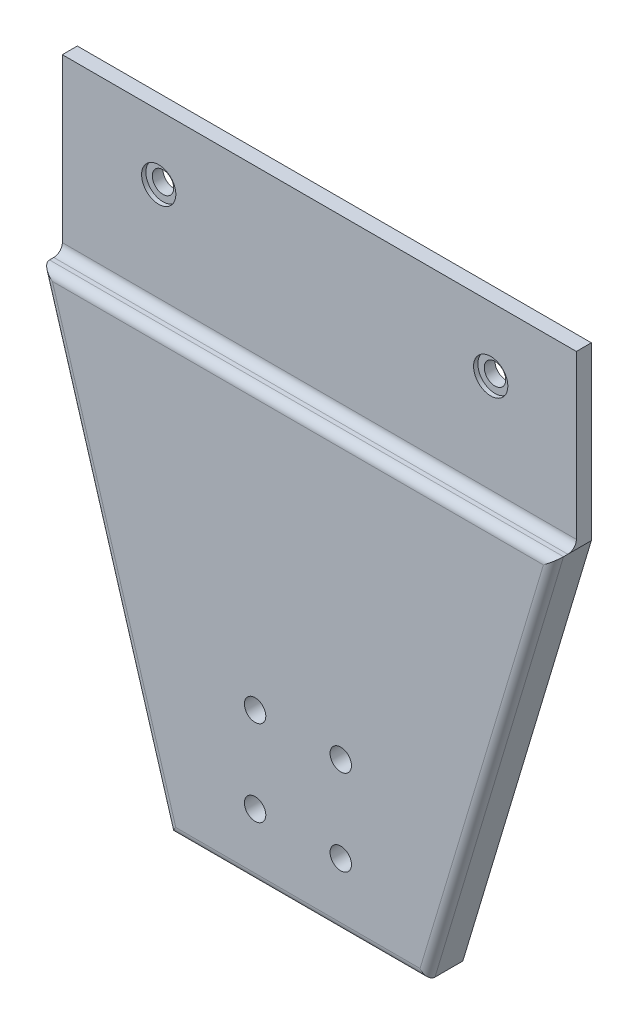
ISO-10303-21;
HEADER;
FILE_DESCRIPTION(('STEP AP214'),'2;1');
FILE_NAME('part.step','',(''),(''),'','','');
FILE_SCHEMA(('AUTOMOTIVE_DESIGN { 1 0 10303 214 1 1 1 1 }'));
ENDSEC;
DATA;
#1=APPLICATION_CONTEXT('core data for automotive mechanical design processes');
#2=APPLICATION_PROTOCOL_DEFINITION('international standard','automotive_design',2000,#1);
#3=PRODUCT_CONTEXT('',#1,'mechanical');
#4=PRODUCT('Part','Part','',(#3));
#5=PRODUCT_RELATED_PRODUCT_CATEGORY('part','',(#4));
#6=PRODUCT_DEFINITION_FORMATION('','',#4);
#7=PRODUCT_DEFINITION_CONTEXT('part definition',#1,'design');
#8=PRODUCT_DEFINITION('design','',#6,#7);
#9=PRODUCT_DEFINITION_SHAPE('','',#8);
#10=(LENGTH_UNIT() NAMED_UNIT(*) SI_UNIT(.MILLI.,.METRE.));
#11=(NAMED_UNIT(*) PLANE_ANGLE_UNIT() SI_UNIT($,.RADIAN.));
#12=(NAMED_UNIT(*) SI_UNIT($,.STERADIAN.) SOLID_ANGLE_UNIT());
#13=UNCERTAINTY_MEASURE_WITH_UNIT(LENGTH_MEASURE(1.E-05),#10,'distance_accuracy_value','');
#14=(GEOMETRIC_REPRESENTATION_CONTEXT(3) GLOBAL_UNCERTAINTY_ASSIGNED_CONTEXT((#13)) GLOBAL_UNIT_ASSIGNED_CONTEXT((#10,
#11,#12)) REPRESENTATION_CONTEXT('',''));
#15=CARTESIAN_POINT('',(0.,0.,0.));
#16=DIRECTION('',(0.,0.,1.));
#17=DIRECTION('',(1.,0.,0.));
#18=AXIS2_PLACEMENT_3D('',#15,#16,#17);
#19=CARTESIAN_POINT('',(203.2,-279.4,0.));
#20=DIRECTION('',(0.,0.,-1.));
#21=DIRECTION('',(-1.,0.,0.));
#22=AXIS2_PLACEMENT_3D('',#19,#20,#21);
#23=CYLINDRICAL_SURFACE('',#22,3.175);
#24=CARTESIAN_POINT('',(203.2,-279.4,-10.795));
#25=DIRECTION('',(0.,0.,-1.));
#26=DIRECTION('',(-1.,0.,0.));
#27=AXIS2_PLACEMENT_3D('',#24,#25,#26);
#28=CIRCLE('',#27,3.175);
#29=CARTESIAN_POINT('',(200.025,-279.4,-10.795));
#30=VERTEX_POINT('',#29);
#31=EDGE_CURVE('E219',#30,#30,#28,.T.);
#32=ORIENTED_EDGE('',*,*,#31,.T.);
#33=EDGE_LOOP('',(#32));
#34=FACE_BOUND('',#33,.T.);
#35=CARTESIAN_POINT('',(203.2,-279.4,-7.62));
#36=DIRECTION('',(0.,0.,1.));
#37=DIRECTION('',(1.,0.,0.));
#38=AXIS2_PLACEMENT_3D('',#35,#36,#37);
#39=CIRCLE('',#38,3.175);
#40=CARTESIAN_POINT('',(206.375,-279.4,-7.62));
#41=VERTEX_POINT('',#40);
#42=EDGE_CURVE('E38',#41,#41,#39,.F.);
#43=ORIENTED_EDGE('',*,*,#42,.F.);
#44=EDGE_LOOP('',(#43));
#45=FACE_BOUND('',#44,.T.);
#46=ADVANCED_FACE('F34',(#34,#45),#23,.F.);
#47=CARTESIAN_POINT('',(104.775,-279.4,0.));
#48=DIRECTION('',(0.,0.,-1.));
#49=DIRECTION('',(-1.,0.,0.));
#50=AXIS2_PLACEMENT_3D('',#47,#48,#49);
#51=CYLINDRICAL_SURFACE('',#50,3.175);
#52=CARTESIAN_POINT('',(104.775,-279.4,-10.795));
#53=DIRECTION('',(0.,0.,-1.));
#54=DIRECTION('',(-1.,0.,0.));
#55=AXIS2_PLACEMENT_3D('',#52,#53,#54);
#56=CIRCLE('',#55,3.175);
#57=CARTESIAN_POINT('',(101.6,-279.4,-10.795));
#58=VERTEX_POINT('',#57);
#59=EDGE_CURVE('E135',#58,#58,#56,.T.);
#60=ORIENTED_EDGE('',*,*,#59,.T.);
#61=EDGE_LOOP('',(#60));
#62=FACE_BOUND('',#61,.T.);
#63=CARTESIAN_POINT('',(104.775,-279.4,-7.62));
#64=DIRECTION('',(0.,0.,1.));
#65=DIRECTION('',(1.,0.,0.));
#66=AXIS2_PLACEMENT_3D('',#63,#64,#65);
#67=CIRCLE('',#66,3.175);
#68=CARTESIAN_POINT('',(107.95,-279.4,-7.62));
#69=VERTEX_POINT('',#68);
#70=EDGE_CURVE('E197',#69,#69,#67,.F.);
#71=ORIENTED_EDGE('',*,*,#70,.F.);
#72=EDGE_LOOP('',(#71));
#73=FACE_BOUND('',#72,.T.);
#74=ADVANCED_FACE('F281',(#62,#73),#51,.F.);
#75=CARTESIAN_POINT('',(228.6,-311.15,-10.795));
#76=DIRECTION('',(0.,1.,0.));
#77=DIRECTION('',(0.,0.,1.));
#78=AXIS2_PLACEMENT_3D('',#75,#76,#77);
#79=PLANE('',#78);
#80=DIRECTION('',(0.,0.,1.));
#81=VECTOR('',#80,1.);
#82=CARTESIAN_POINT('',(76.2,-311.15,-10.795));
#83=LINE('',#82,#81);
#84=CARTESIAN_POINT('',(76.2,-311.15,-3.81));
#85=VERTEX_POINT('',#84);
#86=CARTESIAN_POINT('',(76.2,-311.15,-2.54));
#87=VERTEX_POINT('',#86);
#88=EDGE_CURVE('E153',#85,#87,#83,.T.);
#89=ORIENTED_EDGE('',*,*,#88,.T.);
#90=DIRECTION('',(-1.,0.,0.));
#91=VECTOR('',#90,1.);
#92=CARTESIAN_POINT('',(228.6,-311.15,-2.54));
#93=LINE('',#92,#91);
#94=CARTESIAN_POINT('',(228.6,-311.15,-2.54));
#95=VERTEX_POINT('',#94);
#96=EDGE_CURVE('E43',#87,#95,#93,.F.);
#97=ORIENTED_EDGE('',*,*,#96,.T.);
#98=DIRECTION('',(0.,0.,1.));
#99=VECTOR('',#98,1.);
#100=CARTESIAN_POINT('',(228.6,-311.15,-10.795));
#101=LINE('',#100,#99);
#102=CARTESIAN_POINT('',(228.6,-311.15,-3.81));
#103=VERTEX_POINT('',#102);
#104=EDGE_CURVE('E157',#103,#95,#101,.T.);
#105=ORIENTED_EDGE('',*,*,#104,.F.);
#106=DIRECTION('',(1.,0.,0.));
#107=VECTOR('',#106,1.);
#108=CARTESIAN_POINT('',(228.6,-311.15,-3.81));
#109=LINE('',#108,#107);
#110=EDGE_CURVE('E166',#103,#85,#109,.F.);
#111=ORIENTED_EDGE('',*,*,#110,.T.);
#112=EDGE_LOOP('',(#89,#97,#105,#111));
#113=FACE_BOUND('',#112,.T.);
#114=ADVANCED_FACE('F262',(#113),#79,.T.);
#115=CARTESIAN_POINT('',(228.6,-311.15,-10.795));
#116=DIRECTION('',(0.957826285221151,-0.287347885566345,0.));
#117=DIRECTION('',(0.287347885566345,0.957826285221152,0.));
#118=AXIS2_PLACEMENT_3D('',#115,#116,#117);
#119=PLANE('',#118);
#120=ORIENTED_EDGE('',*,*,#104,.T.);
#121=DIRECTION('',(0.287347885566345,0.957826285221152,0.));
#122=VECTOR('',#121,1.);
#123=CARTESIAN_POINT('',(228.6,-311.15,-2.54));
#124=LINE('',#123,#122);
#125=CARTESIAN_POINT('',(190.5,-438.15,-2.54));
#126=VERTEX_POINT('',#125);
#127=EDGE_CURVE('E11',#95,#126,#124,.F.);
#128=ORIENTED_EDGE('',*,*,#127,.T.);
#129=DIRECTION('',(0.,0.,1.));
#130=VECTOR('',#129,1.);
#131=CARTESIAN_POINT('',(190.5,-438.15,-10.795));
#132=LINE('',#131,#130);
#133=CARTESIAN_POINT('',(190.5,-438.15,-10.795));
#134=VERTEX_POINT('',#133);
#135=EDGE_CURVE('E158',#134,#126,#132,.T.);
#136=ORIENTED_EDGE('',*,*,#135,.F.);
#137=DIRECTION('',(0.287347885566345,0.957826285221151,0.));
#138=VECTOR('',#137,1.);
#139=CARTESIAN_POINT('',(228.6,-311.15,-10.795));
#140=LINE('',#139,#138);
#141=CARTESIAN_POINT('',(228.6,-311.15,-10.795));
#142=VERTEX_POINT('',#141);
#143=EDGE_CURVE('E151',#134,#142,#140,.T.);
#144=ORIENTED_EDGE('',*,*,#143,.T.);
#145=EDGE_CURVE('E154',#142,#103,#101,.T.);
#146=ORIENTED_EDGE('',*,*,#145,.T.);
#147=EDGE_LOOP('',(#120,#128,#136,#144,#146));
#148=FACE_BOUND('',#147,.T.);
#149=ADVANCED_FACE('F260',(#148),#119,.T.);
#150=CARTESIAN_POINT('',(190.5,-438.15,-10.795));
#151=DIRECTION('',(0.,-1.,0.));
#152=DIRECTION('',(0.,0.,-1.));
#153=AXIS2_PLACEMENT_3D('',#150,#151,#152);
#154=PLANE('',#153);
#155=ORIENTED_EDGE('',*,*,#135,.T.);
#156=DIRECTION('',(1.,0.,0.));
#157=VECTOR('',#156,1.);
#158=CARTESIAN_POINT('',(190.5,-438.15,-2.54));
#159=LINE('',#158,#157);
#160=CARTESIAN_POINT('',(114.3,-438.15,-2.54));
#161=VERTEX_POINT('',#160);
#162=EDGE_CURVE('E182',#126,#161,#159,.F.);
#163=ORIENTED_EDGE('',*,*,#162,.T.);
#164=DIRECTION('',(0.,0.,1.));
#165=VECTOR('',#164,1.);
#166=CARTESIAN_POINT('',(114.3,-438.15,-10.795));
#167=LINE('',#166,#165);
#168=CARTESIAN_POINT('',(114.3,-438.15,-10.795));
#169=VERTEX_POINT('',#168);
#170=EDGE_CURVE('E161',#169,#161,#167,.T.);
#171=ORIENTED_EDGE('',*,*,#170,.F.);
#172=DIRECTION('',(1.,0.,0.));
#173=VECTOR('',#172,1.);
#174=CARTESIAN_POINT('',(190.5,-438.15,-10.795));
#175=LINE('',#174,#173);
#176=EDGE_CURVE('E143',#169,#134,#175,.T.);
#177=ORIENTED_EDGE('',*,*,#176,.T.);
#178=EDGE_LOOP('',(#155,#163,#171,#177));
#179=FACE_BOUND('',#178,.T.);
#180=ADVANCED_FACE('F316',(#179),#154,.T.);
#181=CARTESIAN_POINT('',(76.2,-311.15,-10.795));
#182=DIRECTION('',(-0.957826285221151,-0.287347885566345,0.));
#183=DIRECTION('',(0.287347885566345,-0.957826285221152,0.));
#184=AXIS2_PLACEMENT_3D('',#181,#182,#183);
#185=PLANE('',#184);
#186=ORIENTED_EDGE('',*,*,#170,.T.);
#187=DIRECTION('',(0.287347885566345,-0.957826285221152,0.));
#188=VECTOR('',#187,1.);
#189=CARTESIAN_POINT('',(76.2,-311.15,-2.54));
#190=LINE('',#189,#188);
#191=EDGE_CURVE('E58',#161,#87,#190,.F.);
#192=ORIENTED_EDGE('',*,*,#191,.T.);
#193=ORIENTED_EDGE('',*,*,#88,.F.);
#194=CARTESIAN_POINT('',(76.2,-311.15,-10.795));
#195=VERTEX_POINT('',#194);
#196=EDGE_CURVE('E163',#195,#85,#83,.T.);
#197=ORIENTED_EDGE('',*,*,#196,.F.);
#198=DIRECTION('',(0.287347885566345,-0.957826285221151,0.));
#199=VECTOR('',#198,1.);
#200=CARTESIAN_POINT('',(76.2,-311.15,-10.795));
#201=LINE('',#200,#199);
#202=EDGE_CURVE('E140',#195,#169,#201,.T.);
#203=ORIENTED_EDGE('',*,*,#202,.T.);
#204=EDGE_LOOP('',(#186,#192,#193,#197,#203));
#205=FACE_BOUND('',#204,.T.);
#206=ADVANCED_FACE('F264',(#205),#185,.T.);
#207=CARTESIAN_POINT('',(0.,0.,-10.795));
#208=DIRECTION('',(0.,0.,1.));
#209=DIRECTION('',(1.,0.,0.));
#210=AXIS2_PLACEMENT_3D('',#207,#208,#209);
#211=PLANE('',#210);
#212=ORIENTED_EDGE('',*,*,#59,.F.);
#213=EDGE_LOOP('',(#212));
#214=FACE_BOUND('',#213,.T.);
#215=CARTESIAN_POINT('',(165.1,-419.1,-10.795));
#216=DIRECTION('',(0.,0.,-1.));
#217=DIRECTION('',(-1.,0.,0.));
#218=AXIS2_PLACEMENT_3D('',#215,#216,#217);
#219=CIRCLE('',#218,3.175);
#220=CARTESIAN_POINT('',(161.925,-419.1,-10.795));
#221=VERTEX_POINT('',#220);
#222=EDGE_CURVE('E196',#221,#221,#219,.T.);
#223=ORIENTED_EDGE('',*,*,#222,.F.);
#224=EDGE_LOOP('',(#223));
#225=FACE_BOUND('',#224,.T.);
#226=ORIENTED_EDGE('',*,*,#31,.F.);
#227=EDGE_LOOP('',(#226));
#228=FACE_BOUND('',#227,.T.);
#229=CARTESIAN_POINT('',(139.7,-393.7,-10.795));
#230=DIRECTION('',(0.,0.,-1.));
#231=DIRECTION('',(-1.,0.,0.));
#232=AXIS2_PLACEMENT_3D('',#229,#230,#231);
#233=CIRCLE('',#232,3.175);
#234=CARTESIAN_POINT('',(136.525,-393.7,-10.795));
#235=VERTEX_POINT('',#234);
#236=EDGE_CURVE('E229',#235,#235,#233,.T.);
#237=ORIENTED_EDGE('',*,*,#236,.F.);
#238=EDGE_LOOP('',(#237));
#239=FACE_BOUND('',#238,.T.);
#240=CARTESIAN_POINT('',(165.1,-393.7,-10.795));
#241=DIRECTION('',(0.,0.,-1.));
#242=DIRECTION('',(-1.,0.,0.));
#243=AXIS2_PLACEMENT_3D('',#240,#241,#242);
#244=CIRCLE('',#243,3.175);
#245=CARTESIAN_POINT('',(161.925,-393.7,-10.795));
#246=VERTEX_POINT('',#245);
#247=EDGE_CURVE('E230',#246,#246,#244,.T.);
#248=ORIENTED_EDGE('',*,*,#247,.F.);
#249=EDGE_LOOP('',(#248));
#250=FACE_BOUND('',#249,.T.);
#251=CARTESIAN_POINT('',(139.7,-419.1,-10.795));
#252=DIRECTION('',(0.,0.,-1.));
#253=DIRECTION('',(-1.,0.,0.));
#254=AXIS2_PLACEMENT_3D('',#251,#252,#253);
#255=CIRCLE('',#254,3.175);
#256=CARTESIAN_POINT('',(136.525,-419.1,-10.795));
#257=VERTEX_POINT('',#256);
#258=EDGE_CURVE('E223',#257,#257,#255,.T.);
#259=ORIENTED_EDGE('',*,*,#258,.F.);
#260=EDGE_LOOP('',(#259));
#261=FACE_BOUND('',#260,.T.);
#262=ORIENTED_EDGE('',*,*,#202,.F.);
#263=DIRECTION('',(0.,-1.,0.));
#264=VECTOR('',#263,1.);
#265=CARTESIAN_POINT('',(76.2,-260.35,-10.795));
#266=LINE('',#265,#264);
#267=CARTESIAN_POINT('',(76.2,-260.35,-10.795));
#268=VERTEX_POINT('',#267);
#269=EDGE_CURVE('E247',#268,#195,#266,.T.);
#270=ORIENTED_EDGE('',*,*,#269,.F.);
#271=DIRECTION('',(-1.,0.,0.));
#272=VECTOR('',#271,1.);
#273=CARTESIAN_POINT('',(76.2,-260.35,-10.795));
#274=LINE('',#273,#272);
#275=CARTESIAN_POINT('',(228.6,-260.35,-10.795));
#276=VERTEX_POINT('',#275);
#277=EDGE_CURVE('E131',#276,#268,#274,.T.);
#278=ORIENTED_EDGE('',*,*,#277,.F.);
#279=DIRECTION('',(0.,-1.,0.));
#280=VECTOR('',#279,1.);
#281=CARTESIAN_POINT('',(228.6,-260.35,-10.795));
#282=LINE('',#281,#280);
#283=EDGE_CURVE('E145',#276,#142,#282,.T.);
#284=ORIENTED_EDGE('',*,*,#283,.T.);
#285=ORIENTED_EDGE('',*,*,#143,.F.);
#286=ORIENTED_EDGE('',*,*,#176,.F.);
#287=EDGE_LOOP('',(#262,#270,#278,#284,#285,#286));
#288=FACE_BOUND('',#287,.T.);
#289=ADVANCED_FACE('F253',(#214,#225,#228,#239,#250,#261,#288),#211,.F.);
#290=CARTESIAN_POINT('',(0.,0.,0.));
#291=DIRECTION('',(0.,0.,1.));
#292=DIRECTION('',(1.,0.,0.));
#293=AXIS2_PLACEMENT_3D('',#290,#291,#292);
#294=PLANE('',#293);
#295=DIRECTION('',(0.287347885566345,-0.957826285221152,0.));
#296=VECTOR('',#295,1.);
#297=CARTESIAN_POINT('',(-13.2964790337035,-3.98894371011104,0.));
#298=LINE('',#297,#296);
#299=CARTESIAN_POINT('',(79.6138378532633,-313.69,0.));
#300=VERTEX_POINT('',#299);
#301=CARTESIAN_POINT('',(116.189837853263,-435.61,0.));
#302=VERTEX_POINT('',#301);
#303=EDGE_CURVE('E177',#300,#302,#298,.T.);
#304=ORIENTED_EDGE('',*,*,#303,.T.);
#305=DIRECTION('',(1.,0.,0.));
#306=VECTOR('',#305,1.);
#307=CARTESIAN_POINT('',(0.,-435.61,0.));
#308=LINE('',#307,#306);
#309=CARTESIAN_POINT('',(188.610162146737,-435.61,0.));
#310=VERTEX_POINT('',#309);
#311=EDGE_CURVE('E179',#302,#310,#308,.T.);
#312=ORIENTED_EDGE('',*,*,#311,.T.);
#313=DIRECTION('',(0.287347885566345,0.957826285221152,0.));
#314=VECTOR('',#313,1.);
#315=CARTESIAN_POINT('',(292.929506556639,-87.8788519669918,0.));
#316=LINE('',#315,#314);
#317=CARTESIAN_POINT('',(225.186162146737,-313.69,0.));
#318=VERTEX_POINT('',#317);
#319=EDGE_CURVE('E173',#310,#318,#316,.T.);
#320=ORIENTED_EDGE('',*,*,#319,.T.);
#321=DIRECTION('',(-1.,0.,0.));
#322=VECTOR('',#321,1.);
#323=CARTESIAN_POINT('',(0.,-313.69,0.));
#324=LINE('',#323,#322);
#325=EDGE_CURVE('E175',#318,#300,#324,.T.);
#326=ORIENTED_EDGE('',*,*,#325,.T.);
#327=EDGE_LOOP('',(#304,#312,#320,#326));
#328=FACE_BOUND('',#327,.T.);
#329=CARTESIAN_POINT('',(165.1,-419.1,0.));
#330=DIRECTION('',(0.,0.,-1.));
#331=DIRECTION('',(-1.,0.,0.));
#332=AXIS2_PLACEMENT_3D('',#329,#330,#331);
#333=CIRCLE('',#332,3.175);
#334=CARTESIAN_POINT('',(161.925,-419.1,0.));
#335=VERTEX_POINT('',#334);
#336=EDGE_CURVE('E220',#335,#335,#333,.T.);
#337=ORIENTED_EDGE('',*,*,#336,.T.);
#338=EDGE_LOOP('',(#337));
#339=FACE_BOUND('',#338,.T.);
#340=CARTESIAN_POINT('',(139.7,-393.7,0.));
#341=DIRECTION('',(0.,0.,-1.));
#342=DIRECTION('',(-1.,0.,0.));
#343=AXIS2_PLACEMENT_3D('',#340,#341,#342);
#344=CIRCLE('',#343,3.175);
#345=CARTESIAN_POINT('',(136.525,-393.7,0.));
#346=VERTEX_POINT('',#345);
#347=EDGE_CURVE('E240',#346,#346,#344,.T.);
#348=ORIENTED_EDGE('',*,*,#347,.T.);
#349=EDGE_LOOP('',(#348));
#350=FACE_BOUND('',#349,.T.);
#351=CARTESIAN_POINT('',(165.1,-393.7,0.));
#352=DIRECTION('',(0.,0.,-1.));
#353=DIRECTION('',(-1.,0.,0.));
#354=AXIS2_PLACEMENT_3D('',#351,#352,#353);
#355=CIRCLE('',#354,3.175);
#356=CARTESIAN_POINT('',(161.925,-393.7,0.));
#357=VERTEX_POINT('',#356);
#358=EDGE_CURVE('E226',#357,#357,#355,.T.);
#359=ORIENTED_EDGE('',*,*,#358,.T.);
#360=EDGE_LOOP('',(#359));
#361=FACE_BOUND('',#360,.T.);
#362=CARTESIAN_POINT('',(139.7,-419.1,0.));
#363=DIRECTION('',(0.,0.,-1.));
#364=DIRECTION('',(-1.,0.,0.));
#365=AXIS2_PLACEMENT_3D('',#362,#363,#364);
#366=CIRCLE('',#365,3.175);
#367=CARTESIAN_POINT('',(136.525,-419.1,0.));
#368=VERTEX_POINT('',#367);
#369=EDGE_CURVE('E233',#368,#368,#366,.T.);
#370=ORIENTED_EDGE('',*,*,#369,.T.);
#371=EDGE_LOOP('',(#370));
#372=FACE_BOUND('',#371,.T.);
#373=ADVANCED_FACE('F307',(#328,#339,#350,#361,#372),#294,.T.);
#374=CARTESIAN_POINT('',(76.2,-260.35,-10.795));
#375=DIRECTION('',(1.,0.,0.));
#376=DIRECTION('',(0.,0.,-1.));
#377=AXIS2_PLACEMENT_3D('',#374,#375,#376);
#378=PLANE('',#377);
#379=ORIENTED_EDGE('',*,*,#196,.T.);
#380=CARTESIAN_POINT('',(76.2,-308.61,-3.81));
#381=DIRECTION('',(1.,0.,0.));
#382=DIRECTION('',(0.,0.,-1.));
#383=AXIS2_PLACEMENT_3D('',#380,#381,#382);
#384=CIRCLE('',#383,2.54);
#385=CARTESIAN_POINT('',(76.2,-308.61,-6.35));
#386=VERTEX_POINT('',#385);
#387=EDGE_CURVE('E139',#85,#386,#384,.T.);
#388=ORIENTED_EDGE('',*,*,#387,.T.);
#389=DIRECTION('',(0.,-1.,0.));
#390=VECTOR('',#389,1.);
#391=CARTESIAN_POINT('',(76.2,-260.35,-6.35));
#392=LINE('',#391,#390);
#393=CARTESIAN_POINT('',(76.2,-260.35,-6.35));
#394=VERTEX_POINT('',#393);
#395=EDGE_CURVE('E119',#394,#386,#392,.T.);
#396=ORIENTED_EDGE('',*,*,#395,.F.);
#397=DIRECTION('',(0.,0.,1.));
#398=VECTOR('',#397,1.);
#399=CARTESIAN_POINT('',(76.2,-260.35,-10.795));
#400=LINE('',#399,#398);
#401=EDGE_CURVE('E126',#268,#394,#400,.T.);
#402=ORIENTED_EDGE('',*,*,#401,.F.);
#403=ORIENTED_EDGE('',*,*,#269,.T.);
#404=EDGE_LOOP('',(#379,#388,#396,#402,#403));
#405=FACE_BOUND('',#404,.T.);
#406=ADVANCED_FACE('F137',(#405),#378,.F.);
#407=CARTESIAN_POINT('',(76.2,-260.35,-6.35));
#408=DIRECTION('',(0.,0.,-1.));
#409=DIRECTION('',(-1.,0.,0.));
#410=AXIS2_PLACEMENT_3D('',#407,#408,#409);
#411=PLANE('',#410);
#412=CARTESIAN_POINT('',(104.775,-279.4,-6.35));
#413=DIRECTION('',(0.,0.,1.));
#414=DIRECTION('',(1.,0.,0.));
#415=AXIS2_PLACEMENT_3D('',#412,#413,#414);
#416=CIRCLE('',#415,5.08000000000002);
#417=CARTESIAN_POINT('',(109.855,-279.4,-6.35));
#418=VERTEX_POINT('',#417);
#419=EDGE_CURVE('E204',#418,#418,#416,.T.);
#420=ORIENTED_EDGE('',*,*,#419,.F.);
#421=EDGE_LOOP('',(#420));
#422=FACE_BOUND('',#421,.T.);
#423=CARTESIAN_POINT('',(203.2,-279.4,-6.35));
#424=DIRECTION('',(0.,0.,1.));
#425=DIRECTION('',(1.,0.,0.));
#426=AXIS2_PLACEMENT_3D('',#423,#424,#425);
#427=CIRCLE('',#426,5.08);
#428=CARTESIAN_POINT('',(208.28,-279.4,-6.35));
#429=VERTEX_POINT('',#428);
#430=EDGE_CURVE('E214',#429,#429,#427,.T.);
#431=ORIENTED_EDGE('',*,*,#430,.F.);
#432=EDGE_LOOP('',(#431));
#433=FACE_BOUND('',#432,.T.);
#434=ORIENTED_EDGE('',*,*,#395,.T.);
#435=DIRECTION('',(1.,0.,0.));
#436=VECTOR('',#435,1.);
#437=CARTESIAN_POINT('',(76.2,-308.61,-6.35));
#438=LINE('',#437,#436);
#439=CARTESIAN_POINT('',(228.6,-308.61,-6.35));
#440=VERTEX_POINT('',#439);
#441=EDGE_CURVE('E156',#386,#440,#438,.T.);
#442=ORIENTED_EDGE('',*,*,#441,.T.);
#443=DIRECTION('',(0.,-1.,0.));
#444=VECTOR('',#443,1.);
#445=CARTESIAN_POINT('',(228.6,-260.35,-6.35));
#446=LINE('',#445,#444);
#447=CARTESIAN_POINT('',(228.6,-260.35,-6.35));
#448=VERTEX_POINT('',#447);
#449=EDGE_CURVE('E122',#448,#440,#446,.T.);
#450=ORIENTED_EDGE('',*,*,#449,.F.);
#451=DIRECTION('',(1.,0.,0.));
#452=VECTOR('',#451,1.);
#453=CARTESIAN_POINT('',(76.2,-260.35,-6.35));
#454=LINE('',#453,#452);
#455=EDGE_CURVE('E114',#394,#448,#454,.T.);
#456=ORIENTED_EDGE('',*,*,#455,.F.);
#457=EDGE_LOOP('',(#434,#442,#450,#456));
#458=FACE_BOUND('',#457,.T.);
#459=ADVANCED_FACE('F116',(#422,#433,#458),#411,.F.);
#460=CARTESIAN_POINT('',(228.6,-260.35,-10.795));
#461=DIRECTION('',(-1.,0.,0.));
#462=DIRECTION('',(0.,0.,1.));
#463=AXIS2_PLACEMENT_3D('',#460,#461,#462);
#464=PLANE('',#463);
#465=ORIENTED_EDGE('',*,*,#145,.F.);
#466=ORIENTED_EDGE('',*,*,#283,.F.);
#467=DIRECTION('',(0.,0.,-1.));
#468=VECTOR('',#467,1.);
#469=CARTESIAN_POINT('',(228.6,-260.35,-10.795));
#470=LINE('',#469,#468);
#471=EDGE_CURVE('E125',#448,#276,#470,.T.);
#472=ORIENTED_EDGE('',*,*,#471,.F.);
#473=ORIENTED_EDGE('',*,*,#449,.T.);
#474=CARTESIAN_POINT('',(228.6,-308.61,-3.81));
#475=DIRECTION('',(-1.,0.,0.));
#476=DIRECTION('',(0.,0.,1.));
#477=AXIS2_PLACEMENT_3D('',#474,#475,#476);
#478=CIRCLE('',#477,2.54);
#479=EDGE_CURVE('E169',#440,#103,#478,.T.);
#480=ORIENTED_EDGE('',*,*,#479,.T.);
#481=EDGE_LOOP('',(#465,#466,#472,#473,#480));
#482=FACE_BOUND('',#481,.T.);
#483=ADVANCED_FACE('F257',(#482),#464,.F.);
#484=CARTESIAN_POINT('',(0.,-260.35,0.));
#485=DIRECTION('',(0.,1.,0.));
#486=DIRECTION('',(0.,0.,1.));
#487=AXIS2_PLACEMENT_3D('',#484,#485,#486);
#488=PLANE('',#487);
#489=ORIENTED_EDGE('',*,*,#401,.T.);
#490=ORIENTED_EDGE('',*,*,#455,.T.);
#491=ORIENTED_EDGE('',*,*,#471,.T.);
#492=ORIENTED_EDGE('',*,*,#277,.T.);
#493=EDGE_LOOP('',(#489,#490,#491,#492));
#494=FACE_BOUND('',#493,.T.);
#495=ADVANCED_FACE('F129',(#494),#488,.T.);
#496=CARTESIAN_POINT('',(139.7,-419.1,0.));
#497=DIRECTION('',(0.,0.,-1.));
#498=DIRECTION('',(-1.,0.,0.));
#499=AXIS2_PLACEMENT_3D('',#496,#497,#498);
#500=CYLINDRICAL_SURFACE('',#499,3.175);
#501=ORIENTED_EDGE('',*,*,#369,.F.);
#502=EDGE_LOOP('',(#501));
#503=FACE_BOUND('',#502,.T.);
#504=ORIENTED_EDGE('',*,*,#258,.T.);
#505=EDGE_LOOP('',(#504));
#506=FACE_BOUND('',#505,.T.);
#507=ADVANCED_FACE('F292',(#503,#506),#500,.F.);
#508=CARTESIAN_POINT('',(165.1,-393.7,0.));
#509=DIRECTION('',(0.,0.,-1.));
#510=DIRECTION('',(-1.,0.,0.));
#511=AXIS2_PLACEMENT_3D('',#508,#509,#510);
#512=CYLINDRICAL_SURFACE('',#511,3.175);
#513=ORIENTED_EDGE('',*,*,#358,.F.);
#514=EDGE_LOOP('',(#513));
#515=FACE_BOUND('',#514,.T.);
#516=ORIENTED_EDGE('',*,*,#247,.T.);
#517=EDGE_LOOP('',(#516));
#518=FACE_BOUND('',#517,.T.);
#519=ADVANCED_FACE('F296',(#515,#518),#512,.F.);
#520=CARTESIAN_POINT('',(139.7,-393.7,0.));
#521=DIRECTION('',(0.,0.,-1.));
#522=DIRECTION('',(-1.,0.,0.));
#523=AXIS2_PLACEMENT_3D('',#520,#521,#522);
#524=CYLINDRICAL_SURFACE('',#523,3.175);
#525=ORIENTED_EDGE('',*,*,#347,.F.);
#526=EDGE_LOOP('',(#525));
#527=FACE_BOUND('',#526,.T.);
#528=ORIENTED_EDGE('',*,*,#236,.T.);
#529=EDGE_LOOP('',(#528));
#530=FACE_BOUND('',#529,.T.);
#531=ADVANCED_FACE('F275',(#527,#530),#524,.F.);
#532=CARTESIAN_POINT('',(165.1,-419.1,0.));
#533=DIRECTION('',(0.,0.,-1.));
#534=DIRECTION('',(-1.,0.,0.));
#535=AXIS2_PLACEMENT_3D('',#532,#533,#534);
#536=CYLINDRICAL_SURFACE('',#535,3.175);
#537=ORIENTED_EDGE('',*,*,#336,.F.);
#538=EDGE_LOOP('',(#537));
#539=FACE_BOUND('',#538,.T.);
#540=ORIENTED_EDGE('',*,*,#222,.T.);
#541=EDGE_LOOP('',(#540));
#542=FACE_BOUND('',#541,.T.);
#543=ADVANCED_FACE('F267',(#539,#542),#536,.F.);
#544=CARTESIAN_POINT('',(76.2,-308.61,-3.81));
#545=DIRECTION('',(1.,0.,0.));
#546=DIRECTION('',(0.,0.,-1.));
#547=AXIS2_PLACEMENT_3D('',#544,#545,#546);
#548=CYLINDRICAL_SURFACE('',#547,2.54);
#549=ORIENTED_EDGE('',*,*,#387,.F.);
#550=ORIENTED_EDGE('',*,*,#110,.F.);
#551=ORIENTED_EDGE('',*,*,#479,.F.);
#552=ORIENTED_EDGE('',*,*,#441,.F.);
#553=EDGE_LOOP('',(#549,#550,#551,#552));
#554=FACE_BOUND('',#553,.T.);
#555=ADVANCED_FACE('F265',(#554),#548,.F.);
#556=CARTESIAN_POINT('',(0.,-313.69,-2.54));
#557=DIRECTION('',(-1.,0.,0.));
#558=DIRECTION('',(0.,0.,1.));
#559=AXIS2_PLACEMENT_3D('',#556,#557,#558);
#560=CYLINDRICAL_SURFACE('',#559,2.54);
#561=CARTESIAN_POINT('',(225.186162146737,-313.69,-2.54));
#562=DIRECTION('',(-0.596930529640449,0.802292928289395,0.));
#563=DIRECTION('',(0.802292928289395,0.596930529640449,0.));
#564=AXIS2_PLACEMENT_3D('',#561,#562,#563);
#565=ELLIPSE('',#564,4.25510151328652,2.54);
#566=EDGE_CURVE('E191',#95,#318,#565,.F.);
#567=ORIENTED_EDGE('',*,*,#566,.F.);
#568=ORIENTED_EDGE('',*,*,#96,.F.);
#569=CARTESIAN_POINT('',(79.6138378532633,-313.69,-2.54));
#570=DIRECTION('',(-0.596930529640449,-0.802292928289395,0.));
#571=DIRECTION('',(-0.802292928289395,0.596930529640449,0.));
#572=AXIS2_PLACEMENT_3D('',#569,#570,#571);
#573=ELLIPSE('',#572,4.25510151328652,2.54);
#574=EDGE_CURVE('E194',#300,#87,#573,.T.);
#575=ORIENTED_EDGE('',*,*,#574,.F.);
#576=ORIENTED_EDGE('',*,*,#325,.F.);
#577=EDGE_LOOP('',(#567,#568,#575,#576));
#578=FACE_BOUND('',#577,.T.);
#579=ADVANCED_FACE('F36',(#578),#560,.T.);
#580=CARTESIAN_POINT('',(-13.2964790337035,-3.98894371011104,-2.54));
#581=DIRECTION('',(0.287347885566345,-0.957826285221152,0.));
#582=DIRECTION('',(0.957826285221152,0.287347885566345,0.));
#583=AXIS2_PLACEMENT_3D('',#580,#581,#582);
#584=CYLINDRICAL_SURFACE('',#583,2.54);
#585=ORIENTED_EDGE('',*,*,#574,.T.);
#586=ORIENTED_EDGE('',*,*,#191,.F.);
#587=CARTESIAN_POINT('',(116.189837853263,-435.61,-2.54));
#588=DIRECTION('',(0.802292928289395,-0.596930529640449,0.));
#589=DIRECTION('',(-0.596930529640449,-0.802292928289395,0.));
#590=AXIS2_PLACEMENT_3D('',#587,#588,#589);
#591=ELLIPSE('',#590,3.16592594853808,2.54);
#592=EDGE_CURVE('E189',#302,#161,#591,.T.);
#593=ORIENTED_EDGE('',*,*,#592,.F.);
#594=ORIENTED_EDGE('',*,*,#303,.F.);
#595=EDGE_LOOP('',(#585,#586,#593,#594));
#596=FACE_BOUND('',#595,.T.);
#597=ADVANCED_FACE('F273',(#596),#584,.T.);
#598=CARTESIAN_POINT('',(292.929506556639,-87.8788519669918,-2.54));
#599=DIRECTION('',(0.287347885566345,0.957826285221152,0.));
#600=DIRECTION('',(-0.957826285221152,0.287347885566345,0.));
#601=AXIS2_PLACEMENT_3D('',#598,#599,#600);
#602=CYLINDRICAL_SURFACE('',#601,2.54);
#603=ORIENTED_EDGE('',*,*,#566,.T.);
#604=ORIENTED_EDGE('',*,*,#319,.F.);
#605=CARTESIAN_POINT('',(188.610162146737,-435.61,-2.54));
#606=DIRECTION('',(0.802292928289395,0.596930529640449,0.));
#607=DIRECTION('',(-0.596930529640449,0.802292928289395,0.));
#608=AXIS2_PLACEMENT_3D('',#605,#606,#607);
#609=ELLIPSE('',#608,3.16592594853808,2.54);
#610=EDGE_CURVE('E187',#126,#310,#609,.F.);
#611=ORIENTED_EDGE('',*,*,#610,.F.);
#612=ORIENTED_EDGE('',*,*,#127,.F.);
#613=EDGE_LOOP('',(#603,#604,#611,#612));
#614=FACE_BOUND('',#613,.T.);
#615=ADVANCED_FACE('F404',(#614),#602,.T.);
#616=CARTESIAN_POINT('',(0.,-435.61,-2.54));
#617=DIRECTION('',(1.,0.,0.));
#618=DIRECTION('',(0.,0.,-1.));
#619=AXIS2_PLACEMENT_3D('',#616,#617,#618);
#620=CYLINDRICAL_SURFACE('',#619,2.54);
#621=ORIENTED_EDGE('',*,*,#592,.T.);
#622=ORIENTED_EDGE('',*,*,#162,.F.);
#623=ORIENTED_EDGE('',*,*,#610,.T.);
#624=ORIENTED_EDGE('',*,*,#311,.F.);
#625=EDGE_LOOP('',(#621,#622,#623,#624));
#626=FACE_BOUND('',#625,.T.);
#627=ADVANCED_FACE('F412',(#626),#620,.T.);
#628=CARTESIAN_POINT('',(104.775,-279.4,-7.62));
#629=DIRECTION('',(0.,0.,1.));
#630=DIRECTION('',(1.,0.,0.));
#631=AXIS2_PLACEMENT_3D('',#628,#629,#630);
#632=PLANE('',#631);
#633=CARTESIAN_POINT('',(104.775,-279.4,-7.62));
#634=DIRECTION('',(0.,0.,1.));
#635=DIRECTION('',(1.,0.,0.));
#636=AXIS2_PLACEMENT_3D('',#633,#634,#635);
#637=CIRCLE('',#636,5.08000000000002);
#638=CARTESIAN_POINT('',(109.855,-279.4,-7.62));
#639=VERTEX_POINT('',#638);
#640=EDGE_CURVE('E199',#639,#639,#637,.T.);
#641=ORIENTED_EDGE('',*,*,#640,.T.);
#642=EDGE_LOOP('',(#641));
#643=FACE_BOUND('',#642,.T.);
#644=ORIENTED_EDGE('',*,*,#70,.T.);
#645=EDGE_LOOP('',(#644));
#646=FACE_BOUND('',#645,.T.);
#647=ADVANCED_FACE('F421',(#643,#646),#632,.T.);
#648=CARTESIAN_POINT('',(104.775,-279.4,-7.62));
#649=DIRECTION('',(0.,0.,1.));
#650=DIRECTION('',(1.,0.,0.));
#651=AXIS2_PLACEMENT_3D('',#648,#649,#650);
#652=CYLINDRICAL_SURFACE('',#651,5.08000000000002);
#653=ORIENTED_EDGE('',*,*,#640,.F.);
#654=EDGE_LOOP('',(#653));
#655=FACE_BOUND('',#654,.T.);
#656=ORIENTED_EDGE('',*,*,#419,.T.);
#657=EDGE_LOOP('',(#656));
#658=FACE_BOUND('',#657,.T.);
#659=ADVANCED_FACE('F436',(#655,#658),#652,.F.);
#660=CARTESIAN_POINT('',(203.2,-279.4,-7.62));
#661=DIRECTION('',(0.,0.,1.));
#662=DIRECTION('',(1.,0.,0.));
#663=AXIS2_PLACEMENT_3D('',#660,#661,#662);
#664=PLANE('',#663);
#665=CARTESIAN_POINT('',(203.2,-279.4,-7.62));
#666=DIRECTION('',(0.,0.,1.));
#667=DIRECTION('',(1.,0.,0.));
#668=AXIS2_PLACEMENT_3D('',#665,#666,#667);
#669=CIRCLE('',#668,5.08);
#670=CARTESIAN_POINT('',(208.28,-279.4,-7.62));
#671=VERTEX_POINT('',#670);
#672=EDGE_CURVE('E209',#671,#671,#669,.T.);
#673=ORIENTED_EDGE('',*,*,#672,.T.);
#674=EDGE_LOOP('',(#673));
#675=FACE_BOUND('',#674,.T.);
#676=ORIENTED_EDGE('',*,*,#42,.T.);
#677=EDGE_LOOP('',(#676));
#678=FACE_BOUND('',#677,.T.);
#679=ADVANCED_FACE('F444',(#675,#678),#664,.T.);
#680=CARTESIAN_POINT('',(203.2,-279.4,-7.62));
#681=DIRECTION('',(0.,0.,1.));
#682=DIRECTION('',(1.,0.,0.));
#683=AXIS2_PLACEMENT_3D('',#680,#681,#682);
#684=CYLINDRICAL_SURFACE('',#683,5.08);
#685=ORIENTED_EDGE('',*,*,#672,.F.);
#686=EDGE_LOOP('',(#685));
#687=FACE_BOUND('',#686,.T.);
#688=ORIENTED_EDGE('',*,*,#430,.T.);
#689=EDGE_LOOP('',(#688));
#690=FACE_BOUND('',#689,.T.);
#691=ADVANCED_FACE('F453',(#687,#690),#684,.F.);
#692=CLOSED_SHELL('',(#46,#74,#114,#149,#180,#206,#289,#373,#406,#459,#483,#495,#507,#519,#531,
#543,#555,#579,#597,#615,#627,#647,#659,#679,#691));
#693=MANIFOLD_SOLID_BREP('B2',#692);
#694=ADVANCED_BREP_SHAPE_REPRESENTATION('',(#18,#693),#14);
#695=SHAPE_DEFINITION_REPRESENTATION(#9,#694);
ENDSEC;
END-ISO-10303-21;
